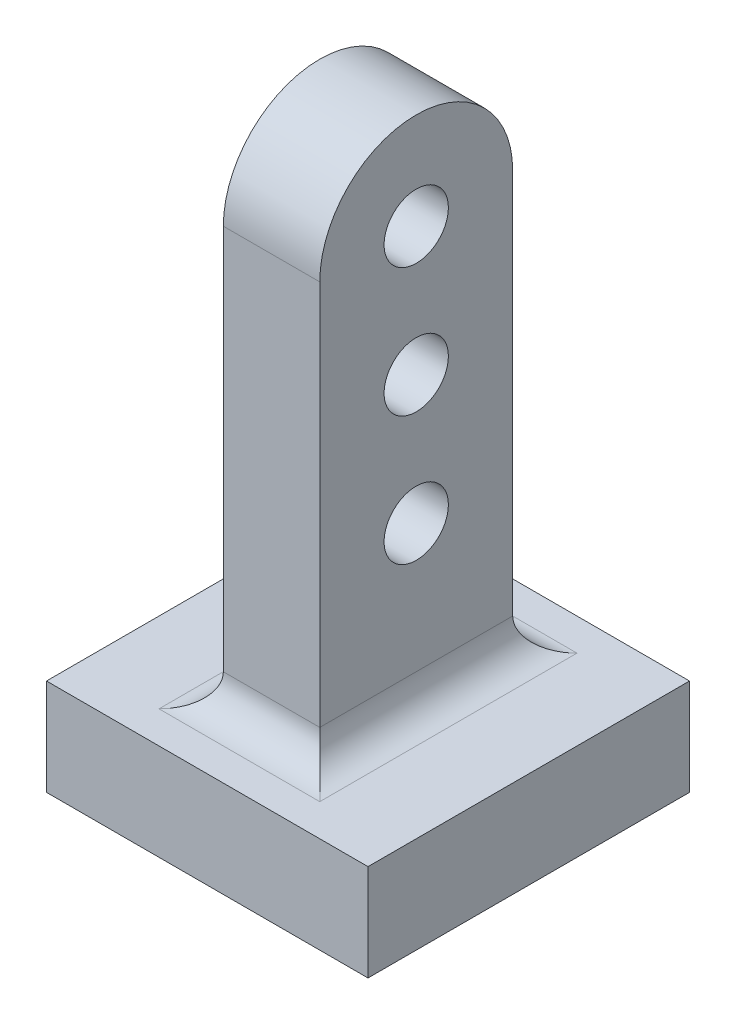
ISO-10303-21;
HEADER;
FILE_DESCRIPTION(('STEP AP214'),'2;1');
FILE_NAME('part.step','',(''),(''),'','','');
FILE_SCHEMA(('AUTOMOTIVE_DESIGN { 1 0 10303 214 1 1 1 1 }'));
ENDSEC;
DATA;
#1=APPLICATION_CONTEXT('core data for automotive mechanical design processes');
#2=APPLICATION_PROTOCOL_DEFINITION('international standard','automotive_design',2000,#1);
#3=PRODUCT_CONTEXT('',#1,'mechanical');
#4=PRODUCT('Part','Part','',(#3));
#5=PRODUCT_RELATED_PRODUCT_CATEGORY('part','',(#4));
#6=PRODUCT_DEFINITION_FORMATION('','',#4);
#7=PRODUCT_DEFINITION_CONTEXT('part definition',#1,'design');
#8=PRODUCT_DEFINITION('design','',#6,#7);
#9=PRODUCT_DEFINITION_SHAPE('','',#8);
#10=(LENGTH_UNIT() NAMED_UNIT(*) SI_UNIT(.MILLI.,.METRE.));
#11=(NAMED_UNIT(*) PLANE_ANGLE_UNIT() SI_UNIT($,.RADIAN.));
#12=(NAMED_UNIT(*) SI_UNIT($,.STERADIAN.) SOLID_ANGLE_UNIT());
#13=UNCERTAINTY_MEASURE_WITH_UNIT(LENGTH_MEASURE(1.E-05),#10,'distance_accuracy_value','');
#14=(GEOMETRIC_REPRESENTATION_CONTEXT(3) GLOBAL_UNCERTAINTY_ASSIGNED_CONTEXT((#13)) GLOBAL_UNIT_ASSIGNED_CONTEXT((#10,
#11,#12)) REPRESENTATION_CONTEXT('',''));
#15=CARTESIAN_POINT('',(0.,0.,0.));
#16=DIRECTION('',(0.,0.,1.));
#17=DIRECTION('',(1.,0.,0.));
#18=AXIS2_PLACEMENT_3D('',#15,#16,#17);
#19=CARTESIAN_POINT('',(-5.,3.,5.));
#20=DIRECTION('',(1.,0.,0.));
#21=DIRECTION('',(0.,0.,-1.));
#22=AXIS2_PLACEMENT_3D('',#19,#20,#21);
#23=PLANE('',#22);
#24=DIRECTION('',(0.,0.,1.));
#25=VECTOR('',#24,1.);
#26=CARTESIAN_POINT('',(-5.,0.,5.));
#27=LINE('',#26,#25);
#28=CARTESIAN_POINT('',(-5.,0.,-5.));
#29=VERTEX_POINT('',#28);
#30=CARTESIAN_POINT('',(-5.,0.,5.));
#31=VERTEX_POINT('',#30);
#32=EDGE_CURVE('E140',#29,#31,#27,.T.);
#33=ORIENTED_EDGE('',*,*,#32,.T.);
#34=DIRECTION('',(0.,-1.,0.));
#35=VECTOR('',#34,1.);
#36=CARTESIAN_POINT('',(-5.,3.,5.));
#37=LINE('',#36,#35);
#38=CARTESIAN_POINT('',(-5.,3.,5.));
#39=VERTEX_POINT('',#38);
#40=EDGE_CURVE('E199',#39,#31,#37,.T.);
#41=ORIENTED_EDGE('',*,*,#40,.F.);
#42=DIRECTION('',(0.,0.,1.));
#43=VECTOR('',#42,1.);
#44=CARTESIAN_POINT('',(-5.,3.,5.));
#45=LINE('',#44,#43);
#46=CARTESIAN_POINT('',(-5.,3.,-5.));
#47=VERTEX_POINT('',#46);
#48=EDGE_CURVE('E162',#47,#39,#45,.T.);
#49=ORIENTED_EDGE('',*,*,#48,.F.);
#50=DIRECTION('',(0.,-1.,0.));
#51=VECTOR('',#50,1.);
#52=CARTESIAN_POINT('',(-5.,3.,-5.));
#53=LINE('',#52,#51);
#54=EDGE_CURVE('E176',#47,#29,#53,.T.);
#55=ORIENTED_EDGE('',*,*,#54,.T.);
#56=EDGE_LOOP('',(#33,#41,#49,#55));
#57=FACE_BOUND('',#56,.T.);
#58=ADVANCED_FACE('F39',(#57),#23,.F.);
#59=CARTESIAN_POINT('',(-5.,3.,5.));
#60=DIRECTION('',(0.,0.,-1.));
#61=DIRECTION('',(-1.,0.,0.));
#62=AXIS2_PLACEMENT_3D('',#59,#60,#61);
#63=PLANE('',#62);
#64=DIRECTION('',(1.,0.,0.));
#65=VECTOR('',#64,1.);
#66=CARTESIAN_POINT('',(-5.,0.,5.));
#67=LINE('',#66,#65);
#68=CARTESIAN_POINT('',(5.,0.,5.));
#69=VERTEX_POINT('',#68);
#70=EDGE_CURVE('E180',#31,#69,#67,.T.);
#71=ORIENTED_EDGE('',*,*,#70,.T.);
#72=DIRECTION('',(0.,-1.,0.));
#73=VECTOR('',#72,1.);
#74=CARTESIAN_POINT('',(5.,3.,5.));
#75=LINE('',#74,#73);
#76=CARTESIAN_POINT('',(5.,3.,5.));
#77=VERTEX_POINT('',#76);
#78=EDGE_CURVE('E195',#77,#69,#75,.T.);
#79=ORIENTED_EDGE('',*,*,#78,.F.);
#80=DIRECTION('',(1.,0.,0.));
#81=VECTOR('',#80,1.);
#82=CARTESIAN_POINT('',(-5.,3.,5.));
#83=LINE('',#82,#81);
#84=EDGE_CURVE('E166',#39,#77,#83,.T.);
#85=ORIENTED_EDGE('',*,*,#84,.F.);
#86=ORIENTED_EDGE('',*,*,#40,.T.);
#87=EDGE_LOOP('',(#71,#79,#85,#86));
#88=FACE_BOUND('',#87,.T.);
#89=ADVANCED_FACE('F283',(#88),#63,.F.);
#90=CARTESIAN_POINT('',(5.,3.,5.));
#91=DIRECTION('',(-1.,0.,0.));
#92=DIRECTION('',(0.,0.,1.));
#93=AXIS2_PLACEMENT_3D('',#90,#91,#92);
#94=PLANE('',#93);
#95=DIRECTION('',(0.,0.,-1.));
#96=VECTOR('',#95,1.);
#97=CARTESIAN_POINT('',(5.,0.,5.));
#98=LINE('',#97,#96);
#99=CARTESIAN_POINT('',(5.,0.,-5.));
#100=VERTEX_POINT('',#99);
#101=EDGE_CURVE('E183',#69,#100,#98,.T.);
#102=ORIENTED_EDGE('',*,*,#101,.T.);
#103=DIRECTION('',(0.,-1.,0.));
#104=VECTOR('',#103,1.);
#105=CARTESIAN_POINT('',(5.,3.,-5.));
#106=LINE('',#105,#104);
#107=CARTESIAN_POINT('',(5.,3.,-5.));
#108=VERTEX_POINT('',#107);
#109=EDGE_CURVE('E191',#108,#100,#106,.T.);
#110=ORIENTED_EDGE('',*,*,#109,.F.);
#111=DIRECTION('',(0.,0.,-1.));
#112=VECTOR('',#111,1.);
#113=CARTESIAN_POINT('',(5.,3.,5.));
#114=LINE('',#113,#112);
#115=EDGE_CURVE('E170',#77,#108,#114,.T.);
#116=ORIENTED_EDGE('',*,*,#115,.F.);
#117=ORIENTED_EDGE('',*,*,#78,.T.);
#118=EDGE_LOOP('',(#102,#110,#116,#117));
#119=FACE_BOUND('',#118,.T.);
#120=ADVANCED_FACE('F289',(#119),#94,.F.);
#121=CARTESIAN_POINT('',(-5.,3.,-5.));
#122=DIRECTION('',(0.,0.,1.));
#123=DIRECTION('',(1.,0.,0.));
#124=AXIS2_PLACEMENT_3D('',#121,#122,#123);
#125=PLANE('',#124);
#126=DIRECTION('',(-1.,0.,0.));
#127=VECTOR('',#126,1.);
#128=CARTESIAN_POINT('',(-5.,0.,-5.));
#129=LINE('',#128,#127);
#130=EDGE_CURVE('E167',#100,#29,#129,.T.);
#131=ORIENTED_EDGE('',*,*,#130,.T.);
#132=ORIENTED_EDGE('',*,*,#54,.F.);
#133=DIRECTION('',(-1.,0.,0.));
#134=VECTOR('',#133,1.);
#135=CARTESIAN_POINT('',(-5.,3.,-5.));
#136=LINE('',#135,#134);
#137=EDGE_CURVE('E173',#108,#47,#136,.T.);
#138=ORIENTED_EDGE('',*,*,#137,.F.);
#139=ORIENTED_EDGE('',*,*,#109,.T.);
#140=EDGE_LOOP('',(#131,#132,#138,#139));
#141=FACE_BOUND('',#140,.T.);
#142=ADVANCED_FACE('F332',(#141),#125,.F.);
#143=CARTESIAN_POINT('',(0.,3.,0.));
#144=DIRECTION('',(0.,-1.,0.));
#145=DIRECTION('',(0.,0.,-1.));
#146=AXIS2_PLACEMENT_3D('',#143,#144,#145);
#147=PLANE('',#146);
#148=DIRECTION('',(0.,0.,-1.));
#149=VECTOR('',#148,1.);
#150=CARTESIAN_POINT('',(-2.5,3.,0.));
#151=LINE('',#150,#149);
#152=CARTESIAN_POINT('',(-2.5,3.,4.));
#153=VERTEX_POINT('',#152);
#154=CARTESIAN_POINT('',(-2.5,3.,-4.));
#155=VERTEX_POINT('',#154);
#156=EDGE_CURVE('E212',#153,#155,#151,.T.);
#157=ORIENTED_EDGE('',*,*,#156,.T.);
#158=DIRECTION('',(-1.,0.,0.));
#159=VECTOR('',#158,1.);
#160=CARTESIAN_POINT('',(1.5,3.,-4.));
#161=LINE('',#160,#159);
#162=CARTESIAN_POINT('',(2.5,3.,-4.));
#163=VERTEX_POINT('',#162);
#164=EDGE_CURVE('E215',#155,#163,#161,.F.);
#165=ORIENTED_EDGE('',*,*,#164,.T.);
#166=DIRECTION('',(0.,0.,-1.));
#167=VECTOR('',#166,1.);
#168=CARTESIAN_POINT('',(2.5,3.,3.));
#169=LINE('',#168,#167);
#170=CARTESIAN_POINT('',(2.5,3.,4.));
#171=VERTEX_POINT('',#170);
#172=EDGE_CURVE('E206',#163,#171,#169,.F.);
#173=ORIENTED_EDGE('',*,*,#172,.T.);
#174=DIRECTION('',(-1.,0.,0.));
#175=VECTOR('',#174,1.);
#176=CARTESIAN_POINT('',(-1.5,3.,4.));
#177=LINE('',#176,#175);
#178=EDGE_CURVE('E209',#171,#153,#177,.T.);
#179=ORIENTED_EDGE('',*,*,#178,.T.);
#180=EDGE_LOOP('',(#157,#165,#173,#179));
#181=FACE_BOUND('',#180,.T.);
#182=ORIENTED_EDGE('',*,*,#48,.T.);
#183=ORIENTED_EDGE('',*,*,#84,.T.);
#184=ORIENTED_EDGE('',*,*,#115,.T.);
#185=ORIENTED_EDGE('',*,*,#137,.T.);
#186=EDGE_LOOP('',(#182,#183,#184,#185));
#187=FACE_BOUND('',#186,.T.);
#188=ADVANCED_FACE('F315',(#181,#187),#147,.F.);
#189=CARTESIAN_POINT('',(0.,0.,0.));
#190=DIRECTION('',(0.,-1.,0.));
#191=DIRECTION('',(0.,0.,-1.));
#192=AXIS2_PLACEMENT_3D('',#189,#190,#191);
#193=PLANE('',#192);
#194=ORIENTED_EDGE('',*,*,#32,.F.);
#195=ORIENTED_EDGE('',*,*,#130,.F.);
#196=ORIENTED_EDGE('',*,*,#101,.F.);
#197=ORIENTED_EDGE('',*,*,#70,.F.);
#198=EDGE_LOOP('',(#194,#195,#196,#197));
#199=FACE_BOUND('',#198,.T.);
#200=ADVANCED_FACE('F326',(#199),#193,.T.);
#201=CARTESIAN_POINT('',(1.5,16.,0.));
#202=DIRECTION('',(-1.,0.,0.));
#203=DIRECTION('',(0.,0.,1.));
#204=AXIS2_PLACEMENT_3D('',#201,#202,#203);
#205=PLANE('',#204);
#206=DIRECTION('',(0.,-1.,0.));
#207=VECTOR('',#206,1.);
#208=CARTESIAN_POINT('',(1.5,3.,3.));
#209=LINE('',#208,#207);
#210=CARTESIAN_POINT('',(1.5,16.,3.));
#211=VERTEX_POINT('',#210);
#212=CARTESIAN_POINT('',(1.5,4.,3.));
#213=VERTEX_POINT('',#212);
#214=EDGE_CURVE('E146',#211,#213,#209,.T.);
#215=ORIENTED_EDGE('',*,*,#214,.T.);
#216=DIRECTION('',(0.,0.,-1.));
#217=VECTOR('',#216,1.);
#218=CARTESIAN_POINT('',(1.5,4.,-3.));
#219=LINE('',#218,#217);
#220=CARTESIAN_POINT('',(1.5,4.,-3.));
#221=VERTEX_POINT('',#220);
#222=EDGE_CURVE('E11',#213,#221,#219,.T.);
#223=ORIENTED_EDGE('',*,*,#222,.T.);
#224=DIRECTION('',(0.,1.,0.));
#225=VECTOR('',#224,1.);
#226=CARTESIAN_POINT('',(1.5,3.,-3.));
#227=LINE('',#226,#225);
#228=CARTESIAN_POINT('',(1.5,16.,-3.));
#229=VERTEX_POINT('',#228);
#230=EDGE_CURVE('E119',#221,#229,#227,.T.);
#231=ORIENTED_EDGE('',*,*,#230,.T.);
#232=CARTESIAN_POINT('',(1.5,16.,0.));
#233=DIRECTION('',(1.,0.,0.));
#234=DIRECTION('',(0.,0.,1.));
#235=AXIS2_PLACEMENT_3D('',#232,#233,#234);
#236=CIRCLE('',#235,3.);
#237=EDGE_CURVE('E124',#229,#211,#236,.T.);
#238=ORIENTED_EDGE('',*,*,#237,.T.);
#239=EDGE_LOOP('',(#215,#223,#231,#238));
#240=FACE_BOUND('',#239,.T.);
#241=CARTESIAN_POINT('',(1.5,16.,0.));
#242=DIRECTION('',(1.,0.,0.));
#243=DIRECTION('',(0.,0.,-1.));
#244=AXIS2_PLACEMENT_3D('',#241,#242,#243);
#245=CIRCLE('',#244,1.);
#246=CARTESIAN_POINT('',(1.5,16.,-1.));
#247=VERTEX_POINT('',#246);
#248=EDGE_CURVE('E155',#247,#247,#245,.T.);
#249=ORIENTED_EDGE('',*,*,#248,.F.);
#250=EDGE_LOOP('',(#249));
#251=FACE_BOUND('',#250,.T.);
#252=CARTESIAN_POINT('',(1.5,12.,0.));
#253=DIRECTION('',(1.,0.,0.));
#254=DIRECTION('',(0.,0.,-1.));
#255=AXIS2_PLACEMENT_3D('',#252,#253,#254);
#256=CIRCLE('',#255,1.);
#257=CARTESIAN_POINT('',(1.5,12.,-1.));
#258=VERTEX_POINT('',#257);
#259=EDGE_CURVE('E251',#258,#258,#256,.T.);
#260=ORIENTED_EDGE('',*,*,#259,.F.);
#261=EDGE_LOOP('',(#260));
#262=FACE_BOUND('',#261,.T.);
#263=CARTESIAN_POINT('',(1.5,8.,0.));
#264=DIRECTION('',(1.,0.,0.));
#265=DIRECTION('',(0.,0.,-1.));
#266=AXIS2_PLACEMENT_3D('',#263,#264,#265);
#267=CIRCLE('',#266,1.);
#268=CARTESIAN_POINT('',(1.5,8.,-1.));
#269=VERTEX_POINT('',#268);
#270=EDGE_CURVE('E242',#269,#269,#267,.T.);
#271=ORIENTED_EDGE('',*,*,#270,.F.);
#272=EDGE_LOOP('',(#271));
#273=FACE_BOUND('',#272,.T.);
#274=ADVANCED_FACE('F121',(#240,#251,#262,#273),#205,.F.);
#275=CARTESIAN_POINT('',(-1.5,16.,0.));
#276=DIRECTION('',(-1.,0.,0.));
#277=DIRECTION('',(0.,0.,1.));
#278=AXIS2_PLACEMENT_3D('',#275,#276,#277);
#279=PLANE('',#278);
#280=CARTESIAN_POINT('',(-1.5,12.,0.));
#281=DIRECTION('',(1.,0.,0.));
#282=DIRECTION('',(0.,0.,-1.));
#283=AXIS2_PLACEMENT_3D('',#280,#281,#282);
#284=CIRCLE('',#283,1.);
#285=CARTESIAN_POINT('',(-1.5,12.,-1.));
#286=VERTEX_POINT('',#285);
#287=EDGE_CURVE('E248',#286,#286,#284,.T.);
#288=ORIENTED_EDGE('',*,*,#287,.T.);
#289=EDGE_LOOP('',(#288));
#290=FACE_BOUND('',#289,.T.);
#291=DIRECTION('',(0.,1.,0.));
#292=VECTOR('',#291,1.);
#293=CARTESIAN_POINT('',(-1.5,3.,-3.));
#294=LINE('',#293,#292);
#295=CARTESIAN_POINT('',(-1.5,4.,-3.));
#296=VERTEX_POINT('',#295);
#297=CARTESIAN_POINT('',(-1.5,16.,-3.));
#298=VERTEX_POINT('',#297);
#299=EDGE_CURVE('E136',#296,#298,#294,.T.);
#300=ORIENTED_EDGE('',*,*,#299,.F.);
#301=DIRECTION('',(0.,0.,-1.));
#302=VECTOR('',#301,1.);
#303=CARTESIAN_POINT('',(-1.5,4.,0.));
#304=LINE('',#303,#302);
#305=CARTESIAN_POINT('',(-1.5,4.,3.));
#306=VERTEX_POINT('',#305);
#307=EDGE_CURVE('E64',#296,#306,#304,.F.);
#308=ORIENTED_EDGE('',*,*,#307,.T.);
#309=DIRECTION('',(0.,-1.,0.));
#310=VECTOR('',#309,1.);
#311=CARTESIAN_POINT('',(-1.5,3.,3.));
#312=LINE('',#311,#310);
#313=CARTESIAN_POINT('',(-1.5,16.,3.));
#314=VERTEX_POINT('',#313);
#315=EDGE_CURVE('E131',#314,#306,#312,.T.);
#316=ORIENTED_EDGE('',*,*,#315,.F.);
#317=CARTESIAN_POINT('',(-1.5,16.,0.));
#318=DIRECTION('',(1.,0.,0.));
#319=DIRECTION('',(0.,0.,1.));
#320=AXIS2_PLACEMENT_3D('',#317,#318,#319);
#321=CIRCLE('',#320,3.);
#322=EDGE_CURVE('E154',#298,#314,#321,.T.);
#323=ORIENTED_EDGE('',*,*,#322,.F.);
#324=EDGE_LOOP('',(#300,#308,#316,#323));
#325=FACE_BOUND('',#324,.T.);
#326=CARTESIAN_POINT('',(-1.5,16.,0.));
#327=DIRECTION('',(1.,0.,0.));
#328=DIRECTION('',(0.,0.,-1.));
#329=AXIS2_PLACEMENT_3D('',#326,#327,#328);
#330=CIRCLE('',#329,1.);
#331=CARTESIAN_POINT('',(-1.5,16.,-1.));
#332=VERTEX_POINT('',#331);
#333=EDGE_CURVE('E255',#332,#332,#330,.T.);
#334=ORIENTED_EDGE('',*,*,#333,.T.);
#335=EDGE_LOOP('',(#334));
#336=FACE_BOUND('',#335,.T.);
#337=CARTESIAN_POINT('',(-1.5,8.,0.));
#338=DIRECTION('',(1.,0.,0.));
#339=DIRECTION('',(0.,0.,-1.));
#340=AXIS2_PLACEMENT_3D('',#337,#338,#339);
#341=CIRCLE('',#340,1.);
#342=CARTESIAN_POINT('',(-1.5,8.,-1.));
#343=VERTEX_POINT('',#342);
#344=EDGE_CURVE('E236',#343,#343,#341,.T.);
#345=ORIENTED_EDGE('',*,*,#344,.T.);
#346=EDGE_LOOP('',(#345));
#347=FACE_BOUND('',#346,.T.);
#348=ADVANCED_FACE('F265',(#290,#325,#336,#347),#279,.T.);
#349=CARTESIAN_POINT('',(1.5,3.,-3.));
#350=DIRECTION('',(0.,0.,1.));
#351=DIRECTION('',(1.,0.,0.));
#352=AXIS2_PLACEMENT_3D('',#349,#350,#351);
#353=PLANE('',#352);
#354=ORIENTED_EDGE('',*,*,#230,.F.);
#355=DIRECTION('',(-1.,0.,0.));
#356=VECTOR('',#355,1.);
#357=CARTESIAN_POINT('',(-1.5,4.,-3.));
#358=LINE('',#357,#356);
#359=EDGE_CURVE('E203',#221,#296,#358,.T.);
#360=ORIENTED_EDGE('',*,*,#359,.T.);
#361=ORIENTED_EDGE('',*,*,#299,.T.);
#362=DIRECTION('',(-1.,0.,0.));
#363=VECTOR('',#362,1.);
#364=CARTESIAN_POINT('',(1.5,16.,-3.));
#365=LINE('',#364,#363);
#366=EDGE_CURVE('E134',#229,#298,#365,.T.);
#367=ORIENTED_EDGE('',*,*,#366,.F.);
#368=EDGE_LOOP('',(#354,#360,#361,#367));
#369=FACE_BOUND('',#368,.T.);
#370=ADVANCED_FACE('F135',(#369),#353,.F.);
#371=CARTESIAN_POINT('',(1.5,16.,0.));
#372=DIRECTION('',(-1.,0.,0.));
#373=DIRECTION('',(0.,0.,1.));
#374=AXIS2_PLACEMENT_3D('',#371,#372,#373);
#375=CYLINDRICAL_SURFACE('',#374,3.);
#376=ORIENTED_EDGE('',*,*,#322,.T.);
#377=DIRECTION('',(-1.,0.,0.));
#378=VECTOR('',#377,1.);
#379=CARTESIAN_POINT('',(1.5,16.,3.));
#380=LINE('',#379,#378);
#381=EDGE_CURVE('E141',#211,#314,#380,.T.);
#382=ORIENTED_EDGE('',*,*,#381,.F.);
#383=ORIENTED_EDGE('',*,*,#237,.F.);
#384=ORIENTED_EDGE('',*,*,#366,.T.);
#385=EDGE_LOOP('',(#376,#382,#383,#384));
#386=FACE_BOUND('',#385,.T.);
#387=ADVANCED_FACE('F143',(#386),#375,.T.);
#388=CARTESIAN_POINT('',(1.5,3.,3.));
#389=DIRECTION('',(0.,0.,-1.));
#390=DIRECTION('',(-1.,0.,0.));
#391=AXIS2_PLACEMENT_3D('',#388,#389,#390);
#392=PLANE('',#391);
#393=ORIENTED_EDGE('',*,*,#315,.T.);
#394=DIRECTION('',(-1.,0.,0.));
#395=VECTOR('',#394,1.);
#396=CARTESIAN_POINT('',(1.5,4.,3.));
#397=LINE('',#396,#395);
#398=EDGE_CURVE('E49',#306,#213,#397,.F.);
#399=ORIENTED_EDGE('',*,*,#398,.T.);
#400=ORIENTED_EDGE('',*,*,#214,.F.);
#401=ORIENTED_EDGE('',*,*,#381,.T.);
#402=EDGE_LOOP('',(#393,#399,#400,#401));
#403=FACE_BOUND('',#402,.T.);
#404=ADVANCED_FACE('F270',(#403),#392,.F.);
#405=CARTESIAN_POINT('',(1.5,16.,0.));
#406=DIRECTION('',(-1.,0.,0.));
#407=DIRECTION('',(0.,0.,1.));
#408=AXIS2_PLACEMENT_3D('',#405,#406,#407);
#409=CYLINDRICAL_SURFACE('',#408,1.);
#410=ORIENTED_EDGE('',*,*,#248,.T.);
#411=EDGE_LOOP('',(#410));
#412=FACE_BOUND('',#411,.T.);
#413=ORIENTED_EDGE('',*,*,#333,.F.);
#414=EDGE_LOOP('',(#413));
#415=FACE_BOUND('',#414,.T.);
#416=ADVANCED_FACE('F267',(#412,#415),#409,.F.);
#417=CARTESIAN_POINT('',(1.5,12.,0.));
#418=DIRECTION('',(-1.,0.,0.));
#419=DIRECTION('',(0.,0.,1.));
#420=AXIS2_PLACEMENT_3D('',#417,#418,#419);
#421=CYLINDRICAL_SURFACE('',#420,1.);
#422=ORIENTED_EDGE('',*,*,#259,.T.);
#423=EDGE_LOOP('',(#422));
#424=FACE_BOUND('',#423,.T.);
#425=ORIENTED_EDGE('',*,*,#287,.F.);
#426=EDGE_LOOP('',(#425));
#427=FACE_BOUND('',#426,.T.);
#428=ADVANCED_FACE('F269',(#424,#427),#421,.F.);
#429=CARTESIAN_POINT('',(1.5,8.,0.));
#430=DIRECTION('',(-1.,0.,0.));
#431=DIRECTION('',(0.,0.,1.));
#432=AXIS2_PLACEMENT_3D('',#429,#430,#431);
#433=CYLINDRICAL_SURFACE('',#432,1.);
#434=ORIENTED_EDGE('',*,*,#270,.T.);
#435=EDGE_LOOP('',(#434));
#436=FACE_BOUND('',#435,.T.);
#437=ORIENTED_EDGE('',*,*,#344,.F.);
#438=EDGE_LOOP('',(#437));
#439=FACE_BOUND('',#438,.T.);
#440=ADVANCED_FACE('F277',(#436,#439),#433,.F.);
#441=CARTESIAN_POINT('',(0.,4.,4.));
#442=DIRECTION('',(1.,0.,0.));
#443=DIRECTION('',(0.,0.,-1.));
#444=AXIS2_PLACEMENT_3D('',#441,#442,#443);
#445=CYLINDRICAL_SURFACE('',#444,1.);
#446=CARTESIAN_POINT('',(-2.5,4.,4.));
#447=DIRECTION('',(0.707106781186547,0.,0.707106781186547));
#448=DIRECTION('',(0.707106781186547,0.,-0.707106781186547));
#449=AXIS2_PLACEMENT_3D('',#446,#447,#448);
#450=ELLIPSE('',#449,1.41421356237309,1.);
#451=EDGE_CURVE('E228',#153,#306,#450,.T.);
#452=ORIENTED_EDGE('',*,*,#451,.F.);
#453=ORIENTED_EDGE('',*,*,#178,.F.);
#454=CARTESIAN_POINT('',(2.5,4.,4.));
#455=DIRECTION('',(-0.707106781186547,0.,0.707106781186547));
#456=DIRECTION('',(0.707106781186547,0.,0.707106781186547));
#457=AXIS2_PLACEMENT_3D('',#454,#455,#456);
#458=ELLIPSE('',#457,1.41421356237309,1.);
#459=EDGE_CURVE('E43',#213,#171,#458,.T.);
#460=ORIENTED_EDGE('',*,*,#459,.F.);
#461=ORIENTED_EDGE('',*,*,#398,.F.);
#462=EDGE_LOOP('',(#452,#453,#460,#461));
#463=FACE_BOUND('',#462,.T.);
#464=ADVANCED_FACE('F41',(#463),#445,.F.);
#465=CARTESIAN_POINT('',(2.5,4.,0.));
#466=DIRECTION('',(0.,0.,1.));
#467=DIRECTION('',(1.,0.,0.));
#468=AXIS2_PLACEMENT_3D('',#465,#466,#467);
#469=CYLINDRICAL_SURFACE('',#468,1.);
#470=ORIENTED_EDGE('',*,*,#459,.T.);
#471=ORIENTED_EDGE('',*,*,#172,.F.);
#472=CARTESIAN_POINT('',(2.5,4.,-4.));
#473=DIRECTION('',(0.707106781186547,0.,0.707106781186547));
#474=DIRECTION('',(-0.707106781186547,0.,0.707106781186547));
#475=AXIS2_PLACEMENT_3D('',#472,#473,#474);
#476=ELLIPSE('',#475,1.41421356237309,1.);
#477=EDGE_CURVE('E226',#221,#163,#476,.T.);
#478=ORIENTED_EDGE('',*,*,#477,.F.);
#479=ORIENTED_EDGE('',*,*,#222,.F.);
#480=EDGE_LOOP('',(#470,#471,#478,#479));
#481=FACE_BOUND('',#480,.T.);
#482=ADVANCED_FACE('F300',(#481),#469,.F.);
#483=CARTESIAN_POINT('',(-2.5,4.,0.));
#484=DIRECTION('',(0.,0.,-1.));
#485=DIRECTION('',(-1.,0.,0.));
#486=AXIS2_PLACEMENT_3D('',#483,#484,#485);
#487=CYLINDRICAL_SURFACE('',#486,1.);
#488=ORIENTED_EDGE('',*,*,#451,.T.);
#489=ORIENTED_EDGE('',*,*,#307,.F.);
#490=CARTESIAN_POINT('',(-2.5,4.,-4.));
#491=DIRECTION('',(0.707106781186547,0.,-0.707106781186547));
#492=DIRECTION('',(-0.707106781186547,0.,-0.707106781186547));
#493=AXIS2_PLACEMENT_3D('',#490,#491,#492);
#494=ELLIPSE('',#493,1.41421356237309,1.);
#495=EDGE_CURVE('E223',#155,#296,#494,.F.);
#496=ORIENTED_EDGE('',*,*,#495,.F.);
#497=ORIENTED_EDGE('',*,*,#156,.F.);
#498=EDGE_LOOP('',(#488,#489,#496,#497));
#499=FACE_BOUND('',#498,.T.);
#500=ADVANCED_FACE('F297',(#499),#487,.F.);
#501=CARTESIAN_POINT('',(1.5,4.,-4.));
#502=DIRECTION('',(1.,0.,0.));
#503=DIRECTION('',(0.,0.,-1.));
#504=AXIS2_PLACEMENT_3D('',#501,#502,#503);
#505=CYLINDRICAL_SURFACE('',#504,1.);
#506=ORIENTED_EDGE('',*,*,#477,.T.);
#507=ORIENTED_EDGE('',*,*,#164,.F.);
#508=ORIENTED_EDGE('',*,*,#495,.T.);
#509=ORIENTED_EDGE('',*,*,#359,.F.);
#510=EDGE_LOOP('',(#506,#507,#508,#509));
#511=FACE_BOUND('',#510,.T.);
#512=ADVANCED_FACE('F294',(#511),#505,.F.);
#513=CLOSED_SHELL('',(#58,#89,#120,#142,#188,#200,#274,#348,#370,#387,#404,#416,#428,#440,#464,
#482,#500,#512));
#514=MANIFOLD_SOLID_BREP('B2',#513);
#515=ADVANCED_BREP_SHAPE_REPRESENTATION('',(#18,#514),#14);
#516=SHAPE_DEFINITION_REPRESENTATION(#9,#515);
ENDSEC;
END-ISO-10303-21;
